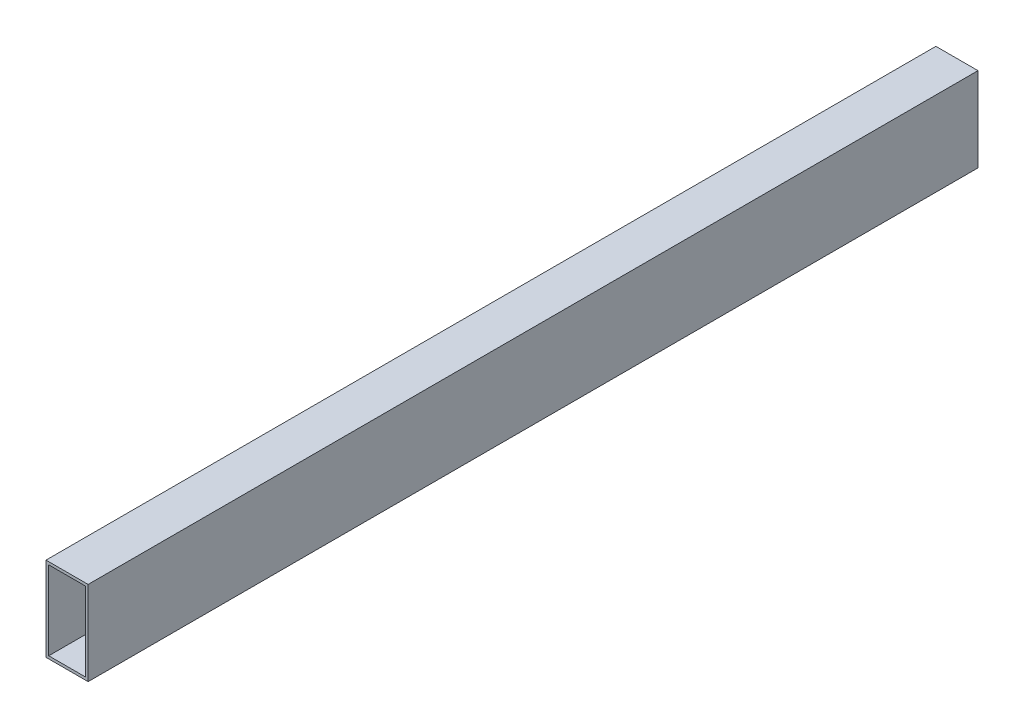
ISO-10303-21;
HEADER;
FILE_DESCRIPTION(('STEP AP214'),'2;1');
FILE_NAME('part.step','',(''),(''),'','','');
FILE_SCHEMA(('AUTOMOTIVE_DESIGN { 1 0 10303 214 1 1 1 1 }'));
ENDSEC;
DATA;
#1=APPLICATION_CONTEXT('core data for automotive mechanical design processes');
#2=APPLICATION_PROTOCOL_DEFINITION('international standard','automotive_design',2000,#1);
#3=PRODUCT_CONTEXT('',#1,'mechanical');
#4=PRODUCT('Part','Part','',(#3));
#5=PRODUCT_RELATED_PRODUCT_CATEGORY('part','',(#4));
#6=PRODUCT_DEFINITION_FORMATION('','',#4);
#7=PRODUCT_DEFINITION_CONTEXT('part definition',#1,'design');
#8=PRODUCT_DEFINITION('design','',#6,#7);
#9=PRODUCT_DEFINITION_SHAPE('','',#8);
#10=(LENGTH_UNIT() NAMED_UNIT(*) SI_UNIT(.MILLI.,.METRE.));
#11=(NAMED_UNIT(*) PLANE_ANGLE_UNIT() SI_UNIT($,.RADIAN.));
#12=(NAMED_UNIT(*) SI_UNIT($,.STERADIAN.) SOLID_ANGLE_UNIT());
#13=UNCERTAINTY_MEASURE_WITH_UNIT(LENGTH_MEASURE(1.E-05),#10,'distance_accuracy_value','');
#14=(GEOMETRIC_REPRESENTATION_CONTEXT(3) GLOBAL_UNCERTAINTY_ASSIGNED_CONTEXT((#13)) GLOBAL_UNIT_ASSIGNED_CONTEXT((#10,
#11,#12)) REPRESENTATION_CONTEXT('',''));
#15=CARTESIAN_POINT('',(0.,0.,0.));
#16=DIRECTION('',(0.,0.,1.));
#17=DIRECTION('',(1.,0.,0.));
#18=AXIS2_PLACEMENT_3D('',#15,#16,#17);
#19=CARTESIAN_POINT('',(-48.4372093023255,-30.1994186046511,536.702));
#20=DIRECTION('',(1.,0.,0.));
#21=DIRECTION('',(0.,0.,-1.));
#22=AXIS2_PLACEMENT_3D('',#19,#20,#21);
#23=PLANE('',#22);
#24=DIRECTION('',(0.,-1.,0.));
#25=VECTOR('',#24,1.);
#26=CARTESIAN_POINT('',(-48.4372093023255,-30.1994186046511,0.));
#27=LINE('',#26,#25);
#28=CARTESIAN_POINT('',(-48.4372093023255,20.6005813953489,0.));
#29=VERTEX_POINT('',#28);
#30=CARTESIAN_POINT('',(-48.4372093023255,-30.1994186046511,0.));
#31=VERTEX_POINT('',#30);
#32=EDGE_CURVE('E130',#29,#31,#27,.T.);
#33=ORIENTED_EDGE('',*,*,#32,.T.);
#34=DIRECTION('',(0.,0.,-1.));
#35=VECTOR('',#34,1.);
#36=CARTESIAN_POINT('',(-48.4372093023255,-30.1994186046511,536.702));
#37=LINE('',#36,#35);
#38=CARTESIAN_POINT('',(-48.4372093023255,-30.1994186046511,536.702));
#39=VERTEX_POINT('',#38);
#40=EDGE_CURVE('E11',#39,#31,#37,.T.);
#41=ORIENTED_EDGE('',*,*,#40,.F.);
#42=DIRECTION('',(0.,-1.,0.));
#43=VECTOR('',#42,1.);
#44=CARTESIAN_POINT('',(-48.4372093023255,-30.1994186046511,536.702));
#45=LINE('',#44,#43);
#46=CARTESIAN_POINT('',(-48.4372093023255,20.6005813953489,536.702));
#47=VERTEX_POINT('',#46);
#48=EDGE_CURVE('E134',#47,#39,#45,.T.);
#49=ORIENTED_EDGE('',*,*,#48,.F.);
#50=DIRECTION('',(0.,0.,-1.));
#51=VECTOR('',#50,1.);
#52=CARTESIAN_POINT('',(-48.4372093023255,20.6005813953489,536.702));
#53=LINE('',#52,#51);
#54=EDGE_CURVE('E144',#47,#29,#53,.T.);
#55=ORIENTED_EDGE('',*,*,#54,.T.);
#56=EDGE_LOOP('',(#33,#41,#49,#55));
#57=FACE_BOUND('',#56,.T.);
#58=ADVANCED_FACE('F33',(#57),#23,.F.);
#59=CARTESIAN_POINT('',(-48.4372093023255,-30.1994186046511,536.702));
#60=DIRECTION('',(0.,1.,0.));
#61=DIRECTION('',(0.,0.,1.));
#62=AXIS2_PLACEMENT_3D('',#59,#60,#61);
#63=PLANE('',#62);
#64=DIRECTION('',(1.,0.,0.));
#65=VECTOR('',#64,1.);
#66=CARTESIAN_POINT('',(-48.4372093023255,-30.1994186046511,0.));
#67=LINE('',#66,#65);
#68=CARTESIAN_POINT('',(-23.0372093023255,-30.1994186046511,0.));
#69=VERTEX_POINT('',#68);
#70=EDGE_CURVE('E147',#31,#69,#67,.T.);
#71=ORIENTED_EDGE('',*,*,#70,.T.);
#72=DIRECTION('',(0.,0.,-1.));
#73=VECTOR('',#72,1.);
#74=CARTESIAN_POINT('',(-23.0372093023255,-30.1994186046511,536.702));
#75=LINE('',#74,#73);
#76=CARTESIAN_POINT('',(-23.0372093023255,-30.1994186046511,536.702));
#77=VERTEX_POINT('',#76);
#78=EDGE_CURVE('E40',#77,#69,#75,.T.);
#79=ORIENTED_EDGE('',*,*,#78,.F.);
#80=DIRECTION('',(1.,0.,0.));
#81=VECTOR('',#80,1.);
#82=CARTESIAN_POINT('',(-48.4372093023255,-30.1994186046511,536.702));
#83=LINE('',#82,#81);
#84=EDGE_CURVE('E137',#39,#77,#83,.T.);
#85=ORIENTED_EDGE('',*,*,#84,.F.);
#86=ORIENTED_EDGE('',*,*,#40,.T.);
#87=EDGE_LOOP('',(#71,#79,#85,#86));
#88=FACE_BOUND('',#87,.T.);
#89=ADVANCED_FACE('F175',(#88),#63,.F.);
#90=CARTESIAN_POINT('',(-23.0372093023255,-30.1994186046511,536.702));
#91=DIRECTION('',(-1.,0.,0.));
#92=DIRECTION('',(0.,-1.,0.));
#93=AXIS2_PLACEMENT_3D('',#90,#91,#92);
#94=PLANE('',#93);
#95=DIRECTION('',(0.,1.,0.));
#96=VECTOR('',#95,1.);
#97=CARTESIAN_POINT('',(-23.0372093023255,-30.1994186046511,0.));
#98=LINE('',#97,#96);
#99=CARTESIAN_POINT('',(-23.0372093023255,20.6005813953489,0.));
#100=VERTEX_POINT('',#99);
#101=EDGE_CURVE('E149',#69,#100,#98,.T.);
#102=ORIENTED_EDGE('',*,*,#101,.T.);
#103=DIRECTION('',(0.,0.,-1.));
#104=VECTOR('',#103,1.);
#105=CARTESIAN_POINT('',(-23.0372093023255,20.6005813953489,536.702));
#106=LINE('',#105,#104);
#107=CARTESIAN_POINT('',(-23.0372093023255,20.6005813953489,536.702));
#108=VERTEX_POINT('',#107);
#109=EDGE_CURVE('E154',#108,#100,#106,.T.);
#110=ORIENTED_EDGE('',*,*,#109,.F.);
#111=DIRECTION('',(0.,1.,0.));
#112=VECTOR('',#111,1.);
#113=CARTESIAN_POINT('',(-23.0372093023255,-30.1994186046511,536.702));
#114=LINE('',#113,#112);
#115=EDGE_CURVE('E140',#77,#108,#114,.T.);
#116=ORIENTED_EDGE('',*,*,#115,.F.);
#117=ORIENTED_EDGE('',*,*,#78,.T.);
#118=EDGE_LOOP('',(#102,#110,#116,#117));
#119=FACE_BOUND('',#118,.T.);
#120=ADVANCED_FACE('F161',(#119),#94,.F.);
#121=CARTESIAN_POINT('',(-48.4372093023255,20.6005813953489,536.702));
#122=DIRECTION('',(0.,-1.,0.));
#123=DIRECTION('',(0.,0.,-1.));
#124=AXIS2_PLACEMENT_3D('',#121,#122,#123);
#125=PLANE('',#124);
#126=DIRECTION('',(-1.,0.,0.));
#127=VECTOR('',#126,1.);
#128=CARTESIAN_POINT('',(-48.4372093023255,20.6005813953489,0.));
#129=LINE('',#128,#127);
#130=EDGE_CURVE('E138',#100,#29,#129,.T.);
#131=ORIENTED_EDGE('',*,*,#130,.T.);
#132=ORIENTED_EDGE('',*,*,#54,.F.);
#133=DIRECTION('',(-1.,0.,0.));
#134=VECTOR('',#133,1.);
#135=CARTESIAN_POINT('',(-48.4372093023255,20.6005813953489,536.702));
#136=LINE('',#135,#134);
#137=EDGE_CURVE('E142',#108,#47,#136,.T.);
#138=ORIENTED_EDGE('',*,*,#137,.F.);
#139=ORIENTED_EDGE('',*,*,#109,.T.);
#140=EDGE_LOOP('',(#131,#132,#138,#139));
#141=FACE_BOUND('',#140,.T.);
#142=ADVANCED_FACE('F168',(#141),#125,.F.);
#143=CARTESIAN_POINT('',(0.,0.,536.702));
#144=DIRECTION('',(0.,0.,-1.));
#145=DIRECTION('',(-1.,0.,0.));
#146=AXIS2_PLACEMENT_3D('',#143,#144,#145);
#147=PLANE('',#146);
#148=DIRECTION('',(-1.,0.,0.));
#149=VECTOR('',#148,1.);
#150=CARTESIAN_POINT('',(-46.7862093023255,18.9495813953489,536.702));
#151=LINE('',#150,#149);
#152=CARTESIAN_POINT('',(-24.6882093023255,18.9495813953489,536.702));
#153=VERTEX_POINT('',#152);
#154=CARTESIAN_POINT('',(-46.7862093023255,18.9495813953489,536.702));
#155=VERTEX_POINT('',#154);
#156=EDGE_CURVE('E124',#153,#155,#151,.T.);
#157=ORIENTED_EDGE('',*,*,#156,.F.);
#158=DIRECTION('',(0.,1.,0.));
#159=VECTOR('',#158,1.);
#160=CARTESIAN_POINT('',(-24.6882093023255,18.9495813953489,536.702));
#161=LINE('',#160,#159);
#162=CARTESIAN_POINT('',(-24.6882093023255,-28.5484186046511,536.702));
#163=VERTEX_POINT('',#162);
#164=EDGE_CURVE('E47',#163,#153,#161,.T.);
#165=ORIENTED_EDGE('',*,*,#164,.F.);
#166=DIRECTION('',(1.,0.,0.));
#167=VECTOR('',#166,1.);
#168=CARTESIAN_POINT('',(-46.7862093023255,-28.5484186046511,536.702));
#169=LINE('',#168,#167);
#170=CARTESIAN_POINT('',(-46.7862093023255,-28.5484186046511,536.702));
#171=VERTEX_POINT('',#170);
#172=EDGE_CURVE('E115',#171,#163,#169,.T.);
#173=ORIENTED_EDGE('',*,*,#172,.F.);
#174=DIRECTION('',(0.,-1.,0.));
#175=VECTOR('',#174,1.);
#176=CARTESIAN_POINT('',(-46.7862093023255,18.9495813953489,536.702));
#177=LINE('',#176,#175);
#178=EDGE_CURVE('E118',#155,#171,#177,.T.);
#179=ORIENTED_EDGE('',*,*,#178,.F.);
#180=EDGE_LOOP('',(#157,#165,#173,#179));
#181=FACE_BOUND('',#180,.T.);
#182=ORIENTED_EDGE('',*,*,#48,.T.);
#183=ORIENTED_EDGE('',*,*,#84,.T.);
#184=ORIENTED_EDGE('',*,*,#115,.T.);
#185=ORIENTED_EDGE('',*,*,#137,.T.);
#186=EDGE_LOOP('',(#182,#183,#184,#185));
#187=FACE_BOUND('',#186,.T.);
#188=ADVANCED_FACE('F174',(#181,#187),#147,.F.);
#189=CARTESIAN_POINT('',(0.,0.,0.));
#190=DIRECTION('',(0.,0.,-1.));
#191=DIRECTION('',(-1.,0.,0.));
#192=AXIS2_PLACEMENT_3D('',#189,#190,#191);
#193=PLANE('',#192);
#194=DIRECTION('',(0.,1.,0.));
#195=VECTOR('',#194,1.);
#196=CARTESIAN_POINT('',(-24.6882093023255,18.9495813953489,0.));
#197=LINE('',#196,#195);
#198=CARTESIAN_POINT('',(-24.6882093023255,-28.5484186046511,0.));
#199=VERTEX_POINT('',#198);
#200=CARTESIAN_POINT('',(-24.6882093023255,18.9495813953489,0.));
#201=VERTEX_POINT('',#200);
#202=EDGE_CURVE('E99',#199,#201,#197,.T.);
#203=ORIENTED_EDGE('',*,*,#202,.T.);
#204=DIRECTION('',(-1.,0.,0.));
#205=VECTOR('',#204,1.);
#206=CARTESIAN_POINT('',(-46.7862093023255,18.9495813953489,0.));
#207=LINE('',#206,#205);
#208=CARTESIAN_POINT('',(-46.7862093023255,18.9495813953489,0.));
#209=VERTEX_POINT('',#208);
#210=EDGE_CURVE('E108',#201,#209,#207,.T.);
#211=ORIENTED_EDGE('',*,*,#210,.T.);
#212=DIRECTION('',(0.,-1.,0.));
#213=VECTOR('',#212,1.);
#214=CARTESIAN_POINT('',(-46.7862093023255,18.9495813953489,0.));
#215=LINE('',#214,#213);
#216=CARTESIAN_POINT('',(-46.7862093023255,-28.5484186046511,0.));
#217=VERTEX_POINT('',#216);
#218=EDGE_CURVE('E55',#209,#217,#215,.T.);
#219=ORIENTED_EDGE('',*,*,#218,.T.);
#220=DIRECTION('',(1.,0.,0.));
#221=VECTOR('',#220,1.);
#222=CARTESIAN_POINT('',(-46.7862093023255,-28.5484186046511,0.));
#223=LINE('',#222,#221);
#224=EDGE_CURVE('E105',#217,#199,#223,.T.);
#225=ORIENTED_EDGE('',*,*,#224,.T.);
#226=EDGE_LOOP('',(#203,#211,#219,#225));
#227=FACE_BOUND('',#226,.T.);
#228=ORIENTED_EDGE('',*,*,#32,.F.);
#229=ORIENTED_EDGE('',*,*,#130,.F.);
#230=ORIENTED_EDGE('',*,*,#101,.F.);
#231=ORIENTED_EDGE('',*,*,#70,.F.);
#232=EDGE_LOOP('',(#228,#229,#230,#231));
#233=FACE_BOUND('',#232,.T.);
#234=ADVANCED_FACE('F112',(#227,#233),#193,.T.);
#235=CARTESIAN_POINT('',(-24.6882093023255,18.9495813953489,0.));
#236=DIRECTION('',(1.,0.,0.));
#237=DIRECTION('',(0.,1.,0.));
#238=AXIS2_PLACEMENT_3D('',#235,#236,#237);
#239=PLANE('',#238);
#240=ORIENTED_EDGE('',*,*,#164,.T.);
#241=DIRECTION('',(0.,0.,1.));
#242=VECTOR('',#241,1.);
#243=CARTESIAN_POINT('',(-24.6882093023255,18.9495813953489,0.));
#244=LINE('',#243,#242);
#245=EDGE_CURVE('E95',#201,#153,#244,.T.);
#246=ORIENTED_EDGE('',*,*,#245,.F.);
#247=ORIENTED_EDGE('',*,*,#202,.F.);
#248=DIRECTION('',(0.,0.,1.));
#249=VECTOR('',#248,1.);
#250=CARTESIAN_POINT('',(-24.6882093023255,-28.5484186046511,0.));
#251=LINE('',#250,#249);
#252=EDGE_CURVE('E128',#199,#163,#251,.T.);
#253=ORIENTED_EDGE('',*,*,#252,.T.);
#254=EDGE_LOOP('',(#240,#246,#247,#253));
#255=FACE_BOUND('',#254,.T.);
#256=ADVANCED_FACE('F97',(#255),#239,.F.);
#257=CARTESIAN_POINT('',(-46.7862093023255,-28.5484186046511,0.));
#258=DIRECTION('',(0.,-1.,0.));
#259=DIRECTION('',(0.,0.,-1.));
#260=AXIS2_PLACEMENT_3D('',#257,#258,#259);
#261=PLANE('',#260);
#262=ORIENTED_EDGE('',*,*,#172,.T.);
#263=ORIENTED_EDGE('',*,*,#252,.F.);
#264=ORIENTED_EDGE('',*,*,#224,.F.);
#265=DIRECTION('',(0.,0.,1.));
#266=VECTOR('',#265,1.);
#267=CARTESIAN_POINT('',(-46.7862093023255,-28.5484186046511,0.));
#268=LINE('',#267,#266);
#269=EDGE_CURVE('E131',#217,#171,#268,.T.);
#270=ORIENTED_EDGE('',*,*,#269,.T.);
#271=EDGE_LOOP('',(#262,#263,#264,#270));
#272=FACE_BOUND('',#271,.T.);
#273=ADVANCED_FACE('F192',(#272),#261,.F.);
#274=CARTESIAN_POINT('',(-46.7862093023255,18.9495813953489,0.));
#275=DIRECTION('',(-1.,0.,0.));
#276=DIRECTION('',(0.,-1.,0.));
#277=AXIS2_PLACEMENT_3D('',#274,#275,#276);
#278=PLANE('',#277);
#279=ORIENTED_EDGE('',*,*,#178,.T.);
#280=ORIENTED_EDGE('',*,*,#269,.F.);
#281=ORIENTED_EDGE('',*,*,#218,.F.);
#282=DIRECTION('',(0.,0.,1.));
#283=VECTOR('',#282,1.);
#284=CARTESIAN_POINT('',(-46.7862093023255,18.9495813953489,0.));
#285=LINE('',#284,#283);
#286=EDGE_CURVE('E104',#209,#155,#285,.T.);
#287=ORIENTED_EDGE('',*,*,#286,.T.);
#288=EDGE_LOOP('',(#279,#280,#281,#287));
#289=FACE_BOUND('',#288,.T.);
#290=ADVANCED_FACE('F195',(#289),#278,.F.);
#291=CARTESIAN_POINT('',(-46.7862093023255,18.9495813953489,0.));
#292=DIRECTION('',(0.,1.,0.));
#293=DIRECTION('',(0.,0.,1.));
#294=AXIS2_PLACEMENT_3D('',#291,#292,#293);
#295=PLANE('',#294);
#296=ORIENTED_EDGE('',*,*,#156,.T.);
#297=ORIENTED_EDGE('',*,*,#286,.F.);
#298=ORIENTED_EDGE('',*,*,#210,.F.);
#299=ORIENTED_EDGE('',*,*,#245,.T.);
#300=EDGE_LOOP('',(#296,#297,#298,#299));
#301=FACE_BOUND('',#300,.T.);
#302=ADVANCED_FACE('F109',(#301),#295,.F.);
#303=CLOSED_SHELL('',(#58,#89,#120,#142,#188,#234,#256,#273,#290,#302));
#304=MANIFOLD_SOLID_BREP('B2',#303);
#305=ADVANCED_BREP_SHAPE_REPRESENTATION('',(#18,#304),#14);
#306=SHAPE_DEFINITION_REPRESENTATION(#9,#305);
ENDSEC;
END-ISO-10303-21;
